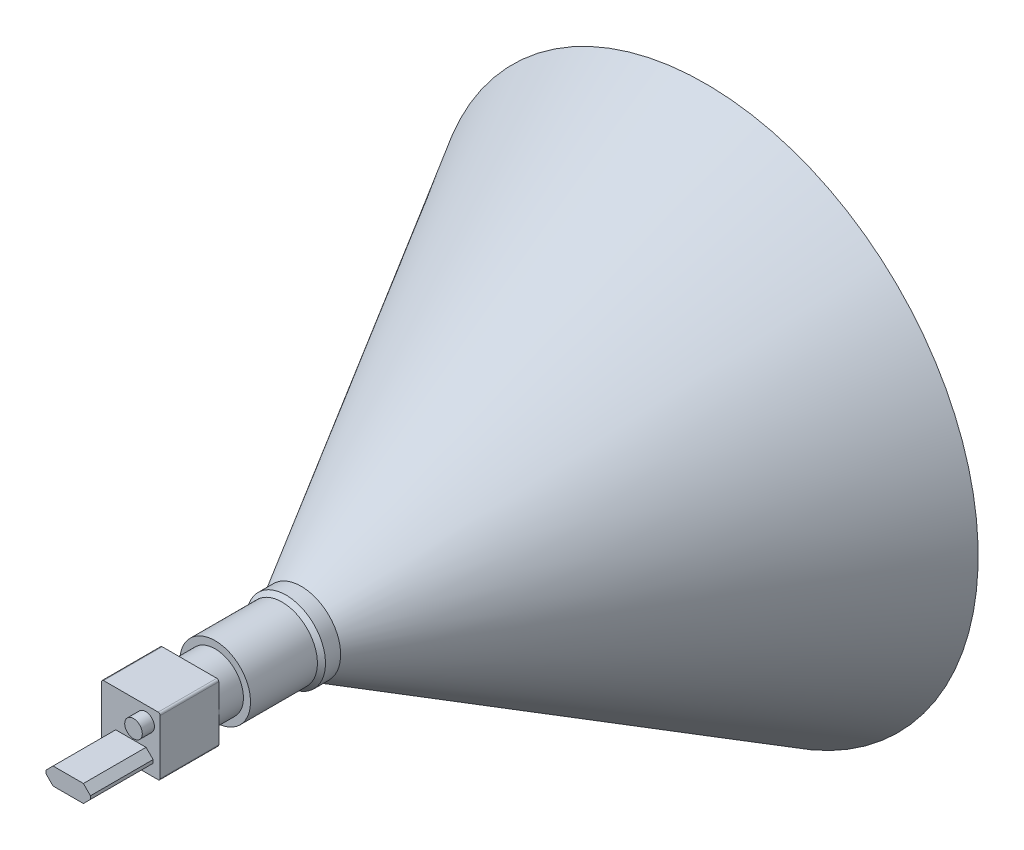
ISO-10303-21;
HEADER;
FILE_DESCRIPTION(('STEP AP214'),'2;1');
FILE_NAME('part.step','',(''),(''),'','','');
FILE_SCHEMA(('AUTOMOTIVE_DESIGN { 1 0 10303 214 1 1 1 1 }'));
ENDSEC;
DATA;
#1=APPLICATION_CONTEXT('core data for automotive mechanical design processes');
#2=APPLICATION_PROTOCOL_DEFINITION('international standard','automotive_design',2000,#1);
#3=PRODUCT_CONTEXT('',#1,'mechanical');
#4=PRODUCT('Part','Part','',(#3));
#5=PRODUCT_RELATED_PRODUCT_CATEGORY('part','',(#4));
#6=PRODUCT_DEFINITION_FORMATION('','',#4);
#7=PRODUCT_DEFINITION_CONTEXT('part definition',#1,'design');
#8=PRODUCT_DEFINITION('design','',#6,#7);
#9=PRODUCT_DEFINITION_SHAPE('','',#8);
#10=(LENGTH_UNIT() NAMED_UNIT(*) SI_UNIT(.MILLI.,.METRE.));
#11=(NAMED_UNIT(*) PLANE_ANGLE_UNIT() SI_UNIT($,.RADIAN.));
#12=(NAMED_UNIT(*) SI_UNIT($,.STERADIAN.) SOLID_ANGLE_UNIT());
#13=UNCERTAINTY_MEASURE_WITH_UNIT(LENGTH_MEASURE(1.E-05),#10,'distance_accuracy_value','');
#14=(GEOMETRIC_REPRESENTATION_CONTEXT(3) GLOBAL_UNCERTAINTY_ASSIGNED_CONTEXT((#13)) GLOBAL_UNIT_ASSIGNED_CONTEXT((#10,
#11,#12)) REPRESENTATION_CONTEXT('',''));
#15=CARTESIAN_POINT('',(0.,0.,0.));
#16=DIRECTION('',(0.,0.,1.));
#17=DIRECTION('',(1.,0.,0.));
#18=AXIS2_PLACEMENT_3D('',#15,#16,#17);
#19=CARTESIAN_POINT('',(0.,14.5,-69.8));
#20=DIRECTION('',(0.,0.,-1.));
#21=DIRECTION('',(-1.,0.,0.));
#22=AXIS2_PLACEMENT_3D('',#19,#20,#21);
#23=CONICAL_SURFACE('',#22,19.5,0.523598775598297);
#24=CARTESIAN_POINT('',(0.,14.5,-269.8));
#25=DIRECTION('',(0.,0.,-1.));
#26=DIRECTION('',(-1.,0.,0.));
#27=AXIS2_PLACEMENT_3D('',#24,#25,#26);
#28=CIRCLE('',#27,134.970053837925);
#29=CARTESIAN_POINT('',(-134.970053837925,14.5,-269.8));
#30=VERTEX_POINT('',#29);
#31=EDGE_CURVE('E11',#30,#30,#28,.T.);
#32=CARTESIAN_POINT('',(0.,14.5,-69.8));
#33=DIRECTION('',(0.,0.,-1.));
#34=DIRECTION('',(-1.,0.,0.));
#35=AXIS2_PLACEMENT_3D('',#32,#33,#34);
#36=CIRCLE('',#35,19.5);
#37=CARTESIAN_POINT('',(-19.5,14.5,-69.8));
#38=VERTEX_POINT('',#37);
#39=EDGE_CURVE('E47',#38,#38,#36,.T.);
#40=CARTESIAN_POINT('',(-134.970053837925,14.5,-269.8));
#41=CARTESIAN_POINT('',(-133.767240777113,14.5,-267.716666666667));
#42=CARTESIAN_POINT('',(-132.564427716301,14.5,-265.633333333333));
#43=CARTESIAN_POINT('',(-130.158801594678,14.5,-261.466666666667));
#44=CARTESIAN_POINT('',(-128.955988533866,14.5,-259.383333333333));
#45=CARTESIAN_POINT('',(-126.550362412243,14.5,-255.216666666667));
#46=CARTESIAN_POINT('',(-125.347549351431,14.5,-253.133333333333));
#47=CARTESIAN_POINT('',(-122.941923229807,14.5,-248.966666666667));
#48=CARTESIAN_POINT('',(-121.739110168996,14.5,-246.883333333333));
#49=CARTESIAN_POINT('',(-119.333484047372,14.5,-242.716666666667));
#50=CARTESIAN_POINT('',(-118.130670986561,14.5,-240.633333333333));
#51=CARTESIAN_POINT('',(-115.725044864937,14.5,-236.466666666667));
#52=CARTESIAN_POINT('',(-114.522231804125,14.5,-234.383333333333));
#53=CARTESIAN_POINT('',(-112.116605682502,14.5,-230.216666666667));
#54=CARTESIAN_POINT('',(-110.91379262169,14.5,-228.133333333333));
#55=CARTESIAN_POINT('',(-108.508166500067,14.5,-223.966666666667));
#56=CARTESIAN_POINT('',(-107.305353439255,14.5,-221.883333333333));
#57=CARTESIAN_POINT('',(-104.899727317632,14.5,-217.716666666667));
#58=CARTESIAN_POINT('',(-103.69691425682,14.5,-215.633333333333));
#59=CARTESIAN_POINT('',(-101.291288135197,14.5,-211.466666666667));
#60=CARTESIAN_POINT('',(-100.088475074385,14.5,-209.383333333333));
#61=CARTESIAN_POINT('',(-97.6828489527614,14.5,-205.216666666667));
#62=CARTESIAN_POINT('',(-96.4800358919497,14.5,-203.133333333333));
#63=CARTESIAN_POINT('',(-94.0744097703263,14.5,-198.966666666667));
#64=CARTESIAN_POINT('',(-92.8715967095145,14.5,-196.883333333333));
#65=CARTESIAN_POINT('',(-90.4659705878911,14.5,-192.716666666667));
#66=CARTESIAN_POINT('',(-89.2631575270794,14.5,-190.633333333333));
#67=CARTESIAN_POINT('',(-86.857531405456,14.5,-186.466666666667));
#68=CARTESIAN_POINT('',(-85.6547183446443,14.5,-184.383333333333));
#69=CARTESIAN_POINT('',(-83.2490922230208,14.5,-180.216666666667));
#70=CARTESIAN_POINT('',(-82.0462791622091,14.5,-178.133333333333));
#71=CARTESIAN_POINT('',(-79.6406530405857,14.5,-173.966666666667));
#72=CARTESIAN_POINT('',(-78.437839979774,14.5,-171.883333333333));
#73=CARTESIAN_POINT('',(-76.0322138581506,14.5,-167.716666666667));
#74=CARTESIAN_POINT('',(-74.8294007973388,14.5,-165.633333333333));
#75=CARTESIAN_POINT('',(-72.4237746757154,14.5,-161.466666666667));
#76=CARTESIAN_POINT('',(-71.2209616149037,14.5,-159.383333333333));
#77=CARTESIAN_POINT('',(-68.8153354932803,14.5,-155.216666666667));
#78=CARTESIAN_POINT('',(-67.6125224324686,14.5,-153.133333333333));
#79=CARTESIAN_POINT('',(-65.2068963108451,14.5,-148.966666666667));
#80=CARTESIAN_POINT('',(-64.0040832500334,14.5,-146.883333333333));
#81=CARTESIAN_POINT('',(-61.59845712841,14.5,-142.716666666667));
#82=CARTESIAN_POINT('',(-60.3956440675983,14.5,-140.633333333333));
#83=CARTESIAN_POINT('',(-57.9900179459748,14.5,-136.466666666667));
#84=CARTESIAN_POINT('',(-56.7872048851631,14.5,-134.383333333333));
#85=CARTESIAN_POINT('',(-54.3815787635397,14.5,-130.216666666667));
#86=CARTESIAN_POINT('',(-53.178765702728,14.5,-128.133333333333));
#87=CARTESIAN_POINT('',(-50.7731395811046,14.5,-123.966666666667));
#88=CARTESIAN_POINT('',(-49.5703265202928,14.5,-121.883333333333));
#89=CARTESIAN_POINT('',(-47.1647003986694,14.5,-117.716666666667));
#90=CARTESIAN_POINT('',(-45.9618873378577,14.5,-115.633333333333));
#91=CARTESIAN_POINT('',(-43.5562612162343,14.5,-111.466666666667));
#92=CARTESIAN_POINT('',(-42.3534481554226,14.5,-109.383333333333));
#93=CARTESIAN_POINT('',(-39.9478220337991,14.5,-105.216666666667));
#94=CARTESIAN_POINT('',(-38.7450089729874,14.5,-103.133333333333));
#95=CARTESIAN_POINT('',(-36.339382851364,14.5,-98.9666666666667));
#96=CARTESIAN_POINT('',(-35.1365697905523,14.5,-96.8833333333333));
#97=CARTESIAN_POINT('',(-32.7309436689289,14.5,-92.7166666666667));
#98=CARTESIAN_POINT('',(-31.5281306081171,14.5,-90.6333333333333));
#99=CARTESIAN_POINT('',(-29.1225044864937,14.5,-86.4666666666667));
#100=CARTESIAN_POINT('',(-27.919691425682,14.5,-84.3833333333333));
#101=CARTESIAN_POINT('',(-25.5140653040586,14.5,-80.2166666666667));
#102=CARTESIAN_POINT('',(-24.3112522432469,14.5,-78.1333333333333));
#103=CARTESIAN_POINT('',(-21.9056261216234,14.5,-73.9666666666667));
#104=CARTESIAN_POINT('',(-20.7028130608117,14.5,-71.8833333333333));
#105=CARTESIAN_POINT('',(-19.5,14.5,-69.8));
#106=B_SPLINE_CURVE_WITH_KNOTS('',3,(#40,#41,#42,#43,#44,#45,#46,#47,#48,#49,#50,#51,#52,#53,
#54,#55,#56,#57,#58,#59,#60,#61,#62,#63,#64,#65,#66,#67,#68,#69,#70,#71,#72,#73,#74,#75,#76,#77,
#78,#79,#80,#81,#82,#83,#84,#85,#86,#87,#88,#89,#90,#91,#92,#93,#94,#95,#96,#97,#98,#99,#100,
#101,#102,#103,#104,#105),.UNSPECIFIED.,.F.,.F.,(4,2,2,2,2,2,2,2,2,2,2,2,2,2,2,2,2,2,2,2,2,2,2,
2,2,2,2,2,2,2,2,2,4),(0.,7.21687836487034,14.4337567297407,21.650635094611,28.8675134594813,
36.0843918243516,43.3012701892219,50.5181485540922,57.7350269189625,64.9519052838328,
72.1687836487031,79.3856620135735,86.6025403784438,93.8194187433141,101.036297108184,
108.253175473055,115.470053837925,122.686932202795,129.903810567666,137.120688932536,
144.337567297406,151.554445662277,158.771324027147,165.988202392017,173.205080756887,
180.421959121758,187.638837486628,194.855715851498,202.072594216369,209.289472581239,
216.506350946109,223.72322931098,230.94010767585),.UNSPECIFIED.);
#107=EDGE_CURVE('BSEAM46',#30,#38,#106,.T.);
#108=ORIENTED_EDGE('',*,*,#31,.T.);
#109=ORIENTED_EDGE('',*,*,#39,.F.);
#110=ORIENTED_EDGE('',*,*,#107,.T.);
#111=ORIENTED_EDGE('',*,*,#107,.F.);
#112=EDGE_LOOP('',(#108,#110,#109,#111));
#113=FACE_BOUND('',#112,.T.);
#114=ADVANCED_FACE('F46',(#113),#23,.F.);
#115=OPEN_SHELL('',(#114));
#116=SHELL_BASED_SURFACE_MODEL('B2',(#115));
#117=CARTESIAN_POINT('',(-14.5,29.,14.5));
#118=DIRECTION('',(0.,0.,-1.));
#119=DIRECTION('',(-1.,0.,0.));
#120=AXIS2_PLACEMENT_3D('',#117,#118,#119);
#121=PLANE('',#120);
#122=CARTESIAN_POINT('',(7.3,21.8,14.5));
#123=DIRECTION('',(0.,0.,-1.));
#124=DIRECTION('',(-1.,0.,0.));
#125=AXIS2_PLACEMENT_3D('',#122,#123,#124);
#126=CIRCLE('',#125,4.35);
#127=CARTESIAN_POINT('',(2.95,21.8,14.5));
#128=VERTEX_POINT('',#127);
#129=EDGE_CURVE('E242',#128,#128,#126,.F.);
#130=ORIENTED_EDGE('',*,*,#129,.F.);
#131=EDGE_LOOP('',(#130));
#132=FACE_BOUND('',#131,.T.);
#133=DIRECTION('',(1.,0.,0.));
#134=VECTOR('',#133,1.);
#135=CARTESIAN_POINT('',(-14.5,0.,14.5));
#136=LINE('',#135,#134);
#137=CARTESIAN_POINT('',(-13.5,0.,14.5));
#138=VERTEX_POINT('',#137);
#139=CARTESIAN_POINT('',(13.5,0.,14.5));
#140=VERTEX_POINT('',#139);
#141=EDGE_CURVE('E347',#138,#140,#136,.T.);
#142=ORIENTED_EDGE('',*,*,#141,.T.);
#143=CARTESIAN_POINT('',(13.5,1.,14.5));
#144=DIRECTION('',(0.,0.,-1.));
#145=DIRECTION('',(-1.,0.,0.));
#146=AXIS2_PLACEMENT_3D('',#143,#144,#145);
#147=CIRCLE('',#146,1.);
#148=CARTESIAN_POINT('',(14.5,1.00000000000001,14.5));
#149=VERTEX_POINT('',#148);
#150=EDGE_CURVE('E230',#140,#149,#147,.F.);
#151=ORIENTED_EDGE('',*,*,#150,.T.);
#152=DIRECTION('',(0.,-1.,0.));
#153=VECTOR('',#152,1.);
#154=CARTESIAN_POINT('',(14.5,29.,14.5));
#155=LINE('',#154,#153);
#156=CARTESIAN_POINT('',(14.5,28.,14.5));
#157=VERTEX_POINT('',#156);
#158=EDGE_CURVE('E350',#157,#149,#155,.T.);
#159=ORIENTED_EDGE('',*,*,#158,.F.);
#160=CARTESIAN_POINT('',(13.5,28.,14.5));
#161=DIRECTION('',(0.,0.,-1.));
#162=DIRECTION('',(-1.,0.,0.));
#163=AXIS2_PLACEMENT_3D('',#160,#161,#162);
#164=CIRCLE('',#163,1.);
#165=CARTESIAN_POINT('',(13.5,29.,14.5));
#166=VERTEX_POINT('',#165);
#167=EDGE_CURVE('E207',#157,#166,#164,.F.);
#168=ORIENTED_EDGE('',*,*,#167,.T.);
#169=DIRECTION('',(1.,0.,0.));
#170=VECTOR('',#169,1.);
#171=CARTESIAN_POINT('',(-14.5,29.,14.5));
#172=LINE('',#171,#170);
#173=CARTESIAN_POINT('',(-13.5,29.,14.5));
#174=VERTEX_POINT('',#173);
#175=EDGE_CURVE('E346',#174,#166,#172,.T.);
#176=ORIENTED_EDGE('',*,*,#175,.F.);
#177=CARTESIAN_POINT('',(-13.5,28.,14.5));
#178=DIRECTION('',(0.,0.,-1.));
#179=DIRECTION('',(-1.,0.,0.));
#180=AXIS2_PLACEMENT_3D('',#177,#178,#179);
#181=CIRCLE('',#180,1.);
#182=CARTESIAN_POINT('',(-14.5,28.,14.5));
#183=VERTEX_POINT('',#182);
#184=EDGE_CURVE('E226',#174,#183,#181,.F.);
#185=ORIENTED_EDGE('',*,*,#184,.T.);
#186=DIRECTION('',(0.,-1.,0.));
#187=VECTOR('',#186,1.);
#188=CARTESIAN_POINT('',(-14.5,29.,14.5));
#189=LINE('',#188,#187);
#190=CARTESIAN_POINT('',(-14.5,1.00000000000001,14.5));
#191=VERTEX_POINT('',#190);
#192=EDGE_CURVE('E356',#183,#191,#189,.T.);
#193=ORIENTED_EDGE('',*,*,#192,.T.);
#194=CARTESIAN_POINT('',(-13.5,1.,14.5));
#195=DIRECTION('',(0.,0.,-1.));
#196=DIRECTION('',(-1.,0.,0.));
#197=AXIS2_PLACEMENT_3D('',#194,#195,#196);
#198=CIRCLE('',#197,1.);
#199=EDGE_CURVE('E228',#191,#138,#198,.F.);
#200=ORIENTED_EDGE('',*,*,#199,.T.);
#201=EDGE_LOOP('',(#142,#151,#159,#168,#176,#185,#193,#200));
#202=FACE_BOUND('',#201,.T.);
#203=DIRECTION('',(0.,-1.,0.));
#204=VECTOR('',#203,1.);
#205=CARTESIAN_POINT('',(-11.,10.9,14.5));
#206=LINE('',#205,#204);
#207=CARTESIAN_POINT('',(-11.,7.4,14.5));
#208=VERTEX_POINT('',#207);
#209=CARTESIAN_POINT('',(-11.,5.80000000000001,14.5));
#210=VERTEX_POINT('',#209);
#211=EDGE_CURVE('E312',#208,#210,#206,.T.);
#212=ORIENTED_EDGE('',*,*,#211,.F.);
#213=DIRECTION('',(-0.707106781186549,-0.707106781186546,0.));
#214=VECTOR('',#213,1.);
#215=CARTESIAN_POINT('',(-1.95000000000001,16.45,14.5));
#216=LINE('',#215,#214);
#217=CARTESIAN_POINT('',(-7.49999999999998,10.9,14.5));
#218=VERTEX_POINT('',#217);
#219=EDGE_CURVE('E44',#208,#218,#216,.F.);
#220=ORIENTED_EDGE('',*,*,#219,.T.);
#221=DIRECTION('',(-1.,0.,0.));
#222=VECTOR('',#221,1.);
#223=CARTESIAN_POINT('',(-11.,10.9,14.5));
#224=LINE('',#223,#222);
#225=CARTESIAN_POINT('',(7.49999999999998,10.9,14.5));
#226=VERTEX_POINT('',#225);
#227=EDGE_CURVE('E280',#226,#218,#224,.T.);
#228=ORIENTED_EDGE('',*,*,#227,.F.);
#229=DIRECTION('',(-0.707106781186546,0.707106781186549,0.));
#230=VECTOR('',#229,1.);
#231=CARTESIAN_POINT('',(-12.55,30.95,14.5));
#232=LINE('',#231,#230);
#233=CARTESIAN_POINT('',(11.,7.39999999999997,14.5));
#234=VERTEX_POINT('',#233);
#235=EDGE_CURVE('E274',#226,#234,#232,.F.);
#236=ORIENTED_EDGE('',*,*,#235,.T.);
#237=DIRECTION('',(0.,1.,0.));
#238=VECTOR('',#237,1.);
#239=CARTESIAN_POINT('',(11.,10.9,14.5));
#240=LINE('',#239,#238);
#241=CARTESIAN_POINT('',(11.,5.8,14.5));
#242=VERTEX_POINT('',#241);
#243=EDGE_CURVE('E278',#242,#234,#240,.T.);
#244=ORIENTED_EDGE('',*,*,#243,.F.);
#245=DIRECTION('',(0.707106781186549,0.707106781186546,0.));
#246=VECTOR('',#245,1.);
#247=CARTESIAN_POINT('',(9.84999999999996,4.64999999999996,14.5));
#248=LINE('',#247,#246);
#249=CARTESIAN_POINT('',(7.49999999999998,2.3,14.5));
#250=VERTEX_POINT('',#249);
#251=EDGE_CURVE('E272',#242,#250,#248,.F.);
#252=ORIENTED_EDGE('',*,*,#251,.T.);
#253=DIRECTION('',(1.,0.,0.));
#254=VECTOR('',#253,1.);
#255=CARTESIAN_POINT('',(-11.,2.3,14.5));
#256=LINE('',#255,#254);
#257=CARTESIAN_POINT('',(-7.5,2.3,14.5));
#258=VERTEX_POINT('',#257);
#259=EDGE_CURVE('E289',#258,#250,#256,.T.);
#260=ORIENTED_EDGE('',*,*,#259,.F.);
#261=DIRECTION('',(0.707106781186548,-0.707106781186548,0.));
#262=VECTOR('',#261,1.);
#263=CARTESIAN_POINT('',(-24.35,19.15,14.5));
#264=LINE('',#263,#262);
#265=EDGE_CURVE('E78',#258,#210,#264,.F.);
#266=ORIENTED_EDGE('',*,*,#265,.T.);
#267=EDGE_LOOP('',(#212,#220,#228,#236,#244,#252,#260,#266));
#268=FACE_BOUND('',#267,.T.);
#269=ADVANCED_FACE('F70',(#132,#202,#268),#121,.F.);
#270=CARTESIAN_POINT('',(14.5,29.,-14.5));
#271=DIRECTION('',(-1.,0.,0.));
#272=DIRECTION('',(0.,0.,1.));
#273=AXIS2_PLACEMENT_3D('',#270,#271,#272);
#274=PLANE('',#273);
#275=ORIENTED_EDGE('',*,*,#158,.T.);
#276=DIRECTION('',(0.,0.,-1.));
#277=VECTOR('',#276,1.);
#278=CARTESIAN_POINT('',(14.5,1.,-14.5));
#279=LINE('',#278,#277);
#280=CARTESIAN_POINT('',(14.5,1.00000000000001,-14.5));
#281=VERTEX_POINT('',#280);
#282=EDGE_CURVE('E193',#149,#281,#279,.T.);
#283=ORIENTED_EDGE('',*,*,#282,.T.);
#284=DIRECTION('',(0.,-1.,0.));
#285=VECTOR('',#284,1.);
#286=CARTESIAN_POINT('',(14.5,29.,-14.5));
#287=LINE('',#286,#285);
#288=CARTESIAN_POINT('',(14.5,28.,-14.5));
#289=VERTEX_POINT('',#288);
#290=EDGE_CURVE('E185',#289,#281,#287,.T.);
#291=ORIENTED_EDGE('',*,*,#290,.F.);
#292=DIRECTION('',(0.,0.,-1.));
#293=VECTOR('',#292,1.);
#294=CARTESIAN_POINT('',(14.5,28.,14.5));
#295=LINE('',#294,#293);
#296=EDGE_CURVE('E199',#289,#157,#295,.F.);
#297=ORIENTED_EDGE('',*,*,#296,.T.);
#298=EDGE_LOOP('',(#275,#283,#291,#297));
#299=FACE_BOUND('',#298,.T.);
#300=ADVANCED_FACE('F198',(#299),#274,.F.);
#301=CARTESIAN_POINT('',(-14.5,29.,-14.5));
#302=DIRECTION('',(0.,0.,1.));
#303=DIRECTION('',(1.,0.,0.));
#304=AXIS2_PLACEMENT_3D('',#301,#302,#303);
#305=PLANE('',#304);
#306=CARTESIAN_POINT('',(0.,14.5,-14.5));
#307=DIRECTION('',(0.,0.,-1.));
#308=DIRECTION('',(-1.,0.,0.));
#309=AXIS2_PLACEMENT_3D('',#306,#307,#308);
#310=CIRCLE('',#309,14.);
#311=CARTESIAN_POINT('',(-14.,14.5,-14.5));
#312=VERTEX_POINT('',#311);
#313=EDGE_CURVE('E202',#312,#312,#310,.T.);
#314=ORIENTED_EDGE('',*,*,#313,.F.);
#315=EDGE_LOOP('',(#314));
#316=FACE_BOUND('',#315,.T.);
#317=ORIENTED_EDGE('',*,*,#290,.T.);
#318=CARTESIAN_POINT('',(13.5,1.,-14.5));
#319=DIRECTION('',(0.,0.,1.));
#320=DIRECTION('',(1.,0.,0.));
#321=AXIS2_PLACEMENT_3D('',#318,#319,#320);
#322=CIRCLE('',#321,1.);
#323=CARTESIAN_POINT('',(13.5,0.,-14.5));
#324=VERTEX_POINT('',#323);
#325=EDGE_CURVE('E219',#281,#324,#322,.F.);
#326=ORIENTED_EDGE('',*,*,#325,.T.);
#327=DIRECTION('',(-1.,0.,0.));
#328=VECTOR('',#327,1.);
#329=CARTESIAN_POINT('',(-14.5,0.,-14.5));
#330=LINE('',#329,#328);
#331=CARTESIAN_POINT('',(-13.5,0.,-14.5));
#332=VERTEX_POINT('',#331);
#333=EDGE_CURVE('E330',#324,#332,#330,.T.);
#334=ORIENTED_EDGE('',*,*,#333,.T.);
#335=CARTESIAN_POINT('',(-13.5,1.,-14.5));
#336=DIRECTION('',(0.,0.,1.));
#337=DIRECTION('',(1.,0.,0.));
#338=AXIS2_PLACEMENT_3D('',#335,#336,#337);
#339=CIRCLE('',#338,1.);
#340=CARTESIAN_POINT('',(-14.5,1.00000000000001,-14.5));
#341=VERTEX_POINT('',#340);
#342=EDGE_CURVE('E217',#332,#341,#339,.F.);
#343=ORIENTED_EDGE('',*,*,#342,.T.);
#344=DIRECTION('',(0.,-1.,0.));
#345=VECTOR('',#344,1.);
#346=CARTESIAN_POINT('',(-14.5,29.,-14.5));
#347=LINE('',#346,#345);
#348=CARTESIAN_POINT('',(-14.5,28.,-14.5));
#349=VERTEX_POINT('',#348);
#350=EDGE_CURVE('E203',#349,#341,#347,.T.);
#351=ORIENTED_EDGE('',*,*,#350,.F.);
#352=CARTESIAN_POINT('',(-13.5,28.,-14.5));
#353=DIRECTION('',(0.,0.,1.));
#354=DIRECTION('',(1.,0.,0.));
#355=AXIS2_PLACEMENT_3D('',#352,#353,#354);
#356=CIRCLE('',#355,1.);
#357=CARTESIAN_POINT('',(-13.5,29.,-14.5));
#358=VERTEX_POINT('',#357);
#359=EDGE_CURVE('E192',#349,#358,#356,.F.);
#360=ORIENTED_EDGE('',*,*,#359,.T.);
#361=DIRECTION('',(-1.,0.,0.));
#362=VECTOR('',#361,1.);
#363=CARTESIAN_POINT('',(-14.5,29.,-14.5));
#364=LINE('',#363,#362);
#365=CARTESIAN_POINT('',(13.5,29.,-14.5));
#366=VERTEX_POINT('',#365);
#367=EDGE_CURVE('E187',#366,#358,#364,.T.);
#368=ORIENTED_EDGE('',*,*,#367,.F.);
#369=CARTESIAN_POINT('',(13.5,28.,-14.5));
#370=DIRECTION('',(0.,0.,1.));
#371=DIRECTION('',(1.,0.,0.));
#372=AXIS2_PLACEMENT_3D('',#369,#370,#371);
#373=CIRCLE('',#372,1.);
#374=EDGE_CURVE('E182',#366,#289,#373,.F.);
#375=ORIENTED_EDGE('',*,*,#374,.T.);
#376=EDGE_LOOP('',(#317,#326,#334,#343,#351,#360,#368,#375));
#377=FACE_BOUND('',#376,.T.);
#378=ADVANCED_FACE('F184',(#316,#377),#305,.F.);
#379=CARTESIAN_POINT('',(-14.5,29.,-14.5));
#380=DIRECTION('',(1.,0.,0.));
#381=DIRECTION('',(0.,0.,-1.));
#382=AXIS2_PLACEMENT_3D('',#379,#380,#381);
#383=PLANE('',#382);
#384=ORIENTED_EDGE('',*,*,#350,.T.);
#385=DIRECTION('',(0.,0.,1.));
#386=VECTOR('',#385,1.);
#387=CARTESIAN_POINT('',(-14.5,1.,-14.5));
#388=LINE('',#387,#386);
#389=EDGE_CURVE('E234',#341,#191,#388,.T.);
#390=ORIENTED_EDGE('',*,*,#389,.T.);
#391=ORIENTED_EDGE('',*,*,#192,.F.);
#392=DIRECTION('',(0.,0.,1.));
#393=VECTOR('',#392,1.);
#394=CARTESIAN_POINT('',(-14.5,28.,-14.5));
#395=LINE('',#394,#393);
#396=EDGE_CURVE('E232',#183,#349,#395,.F.);
#397=ORIENTED_EDGE('',*,*,#396,.T.);
#398=EDGE_LOOP('',(#384,#390,#391,#397));
#399=FACE_BOUND('',#398,.T.);
#400=ADVANCED_FACE('F395',(#399),#383,.F.);
#401=CARTESIAN_POINT('',(0.,29.,0.));
#402=DIRECTION('',(0.,1.,0.));
#403=DIRECTION('',(0.,0.,1.));
#404=AXIS2_PLACEMENT_3D('',#401,#402,#403);
#405=PLANE('',#404);
#406=ORIENTED_EDGE('',*,*,#367,.T.);
#407=DIRECTION('',(0.,0.,1.));
#408=VECTOR('',#407,1.);
#409=CARTESIAN_POINT('',(-13.5,29.,14.5));
#410=LINE('',#409,#408);
#411=EDGE_CURVE('E239',#358,#174,#410,.T.);
#412=ORIENTED_EDGE('',*,*,#411,.T.);
#413=ORIENTED_EDGE('',*,*,#175,.T.);
#414=DIRECTION('',(0.,0.,-1.));
#415=VECTOR('',#414,1.);
#416=CARTESIAN_POINT('',(13.5,29.,-14.5));
#417=LINE('',#416,#415);
#418=EDGE_CURVE('E237',#166,#366,#417,.T.);
#419=ORIENTED_EDGE('',*,*,#418,.T.);
#420=EDGE_LOOP('',(#406,#412,#413,#419));
#421=FACE_BOUND('',#420,.T.);
#422=ADVANCED_FACE('F398',(#421),#405,.T.);
#423=CARTESIAN_POINT('',(0.,0.,0.));
#424=DIRECTION('',(0.,1.,0.));
#425=DIRECTION('',(0.,0.,1.));
#426=AXIS2_PLACEMENT_3D('',#423,#424,#425);
#427=PLANE('',#426);
#428=CARTESIAN_POINT('',(-10.,0.,-11.5));
#429=DIRECTION('',(0.,-1.,0.));
#430=DIRECTION('',(0.,0.,-1.));
#431=AXIS2_PLACEMENT_3D('',#428,#429,#430);
#432=CIRCLE('',#431,1.7);
#433=CARTESIAN_POINT('',(-10.,0.,-13.2));
#434=VERTEX_POINT('',#433);
#435=EDGE_CURVE('E331',#434,#434,#432,.T.);
#436=ORIENTED_EDGE('',*,*,#435,.F.);
#437=EDGE_LOOP('',(#436));
#438=FACE_BOUND('',#437,.T.);
#439=CARTESIAN_POINT('',(9.99999999999999,0.,-11.5));
#440=DIRECTION('',(0.,-1.,0.));
#441=DIRECTION('',(0.,0.,-1.));
#442=AXIS2_PLACEMENT_3D('',#439,#440,#441);
#443=CIRCLE('',#442,1.7);
#444=CARTESIAN_POINT('',(9.99999999999999,0.,-13.2));
#445=VERTEX_POINT('',#444);
#446=EDGE_CURVE('E337',#445,#445,#443,.T.);
#447=ORIENTED_EDGE('',*,*,#446,.F.);
#448=EDGE_LOOP('',(#447));
#449=FACE_BOUND('',#448,.T.);
#450=CARTESIAN_POINT('',(0.,0.,12.));
#451=DIRECTION('',(0.,-1.,0.));
#452=DIRECTION('',(0.,0.,-1.));
#453=AXIS2_PLACEMENT_3D('',#450,#451,#452);
#454=CIRCLE('',#453,1.7);
#455=CARTESIAN_POINT('',(0.,0.,10.3));
#456=VERTEX_POINT('',#455);
#457=EDGE_CURVE('E324',#456,#456,#454,.T.);
#458=ORIENTED_EDGE('',*,*,#457,.F.);
#459=EDGE_LOOP('',(#458));
#460=FACE_BOUND('',#459,.T.);
#461=ORIENTED_EDGE('',*,*,#333,.F.);
#462=DIRECTION('',(0.,0.,-1.));
#463=VECTOR('',#462,1.);
#464=CARTESIAN_POINT('',(13.5,0.,0.));
#465=LINE('',#464,#463);
#466=EDGE_CURVE('E223',#324,#140,#465,.F.);
#467=ORIENTED_EDGE('',*,*,#466,.T.);
#468=ORIENTED_EDGE('',*,*,#141,.F.);
#469=DIRECTION('',(0.,0.,1.));
#470=VECTOR('',#469,1.);
#471=CARTESIAN_POINT('',(-13.5,0.,0.));
#472=LINE('',#471,#470);
#473=EDGE_CURVE('E221',#138,#332,#472,.F.);
#474=ORIENTED_EDGE('',*,*,#473,.T.);
#475=EDGE_LOOP('',(#461,#467,#468,#474));
#476=FACE_BOUND('',#475,.T.);
#477=ADVANCED_FACE('F393',(#438,#449,#460,#476),#427,.F.);
#478=CARTESIAN_POINT('',(0.,4.,12.));
#479=DIRECTION('',(0.,-1.,0.));
#480=DIRECTION('',(0.,0.,-1.));
#481=AXIS2_PLACEMENT_3D('',#478,#479,#480);
#482=CYLINDRICAL_SURFACE('',#481,1.7);
#483=CARTESIAN_POINT('',(0.,4.,12.));
#484=DIRECTION('',(0.,-1.,0.));
#485=DIRECTION('',(0.,0.,-1.));
#486=AXIS2_PLACEMENT_3D('',#483,#484,#485);
#487=CIRCLE('',#486,1.7);
#488=CARTESIAN_POINT('',(0.,4.,10.3));
#489=VERTEX_POINT('',#488);
#490=EDGE_CURVE('E340',#489,#489,#487,.T.);
#491=ORIENTED_EDGE('',*,*,#490,.F.);
#492=EDGE_LOOP('',(#491));
#493=FACE_BOUND('',#492,.T.);
#494=ORIENTED_EDGE('',*,*,#457,.T.);
#495=EDGE_LOOP('',(#494));
#496=FACE_BOUND('',#495,.T.);
#497=ADVANCED_FACE('F439',(#493,#496),#482,.F.);
#498=CARTESIAN_POINT('',(0.,4.,12.));
#499=DIRECTION('',(0.,-1.,0.));
#500=DIRECTION('',(0.,0.,-1.));
#501=AXIS2_PLACEMENT_3D('',#498,#499,#500);
#502=PLANE('',#501);
#503=ORIENTED_EDGE('',*,*,#490,.T.);
#504=EDGE_LOOP('',(#503));
#505=FACE_BOUND('',#504,.T.);
#506=ADVANCED_FACE('F435',(#505),#502,.T.);
#507=CARTESIAN_POINT('',(9.99999999999999,4.,-11.5));
#508=DIRECTION('',(0.,-1.,0.));
#509=DIRECTION('',(0.,0.,-1.));
#510=AXIS2_PLACEMENT_3D('',#507,#508,#509);
#511=CYLINDRICAL_SURFACE('',#510,1.7);
#512=CARTESIAN_POINT('',(9.99999999999999,4.,-11.5));
#513=DIRECTION('',(0.,-1.,0.));
#514=DIRECTION('',(0.,0.,-1.));
#515=AXIS2_PLACEMENT_3D('',#512,#513,#514);
#516=CIRCLE('',#515,1.7);
#517=CARTESIAN_POINT('',(9.99999999999999,4.,-13.2));
#518=VERTEX_POINT('',#517);
#519=EDGE_CURVE('E334',#518,#518,#516,.T.);
#520=ORIENTED_EDGE('',*,*,#519,.F.);
#521=EDGE_LOOP('',(#520));
#522=FACE_BOUND('',#521,.T.);
#523=ORIENTED_EDGE('',*,*,#446,.T.);
#524=EDGE_LOOP('',(#523));
#525=FACE_BOUND('',#524,.T.);
#526=ADVANCED_FACE('F431',(#522,#525),#511,.F.);
#527=CARTESIAN_POINT('',(9.99999999999999,4.,-11.5));
#528=DIRECTION('',(0.,-1.,0.));
#529=DIRECTION('',(0.,0.,-1.));
#530=AXIS2_PLACEMENT_3D('',#527,#528,#529);
#531=PLANE('',#530);
#532=ORIENTED_EDGE('',*,*,#519,.T.);
#533=EDGE_LOOP('',(#532));
#534=FACE_BOUND('',#533,.T.);
#535=ADVANCED_FACE('F427',(#534),#531,.T.);
#536=CARTESIAN_POINT('',(-10.,4.,-11.5));
#537=DIRECTION('',(0.,-1.,0.));
#538=DIRECTION('',(0.,0.,-1.));
#539=AXIS2_PLACEMENT_3D('',#536,#537,#538);
#540=CYLINDRICAL_SURFACE('',#539,1.7);
#541=CARTESIAN_POINT('',(-10.,4.,-11.5));
#542=DIRECTION('',(0.,-1.,0.));
#543=DIRECTION('',(0.,0.,-1.));
#544=AXIS2_PLACEMENT_3D('',#541,#542,#543);
#545=CIRCLE('',#544,1.7);
#546=CARTESIAN_POINT('',(-10.,4.,-13.2));
#547=VERTEX_POINT('',#546);
#548=EDGE_CURVE('E327',#547,#547,#545,.T.);
#549=ORIENTED_EDGE('',*,*,#548,.F.);
#550=EDGE_LOOP('',(#549));
#551=FACE_BOUND('',#550,.T.);
#552=ORIENTED_EDGE('',*,*,#435,.T.);
#553=EDGE_LOOP('',(#552));
#554=FACE_BOUND('',#553,.T.);
#555=ADVANCED_FACE('F419',(#551,#554),#540,.F.);
#556=CARTESIAN_POINT('',(-10.,4.,-11.5));
#557=DIRECTION('',(0.,-1.,0.));
#558=DIRECTION('',(0.,0.,-1.));
#559=AXIS2_PLACEMENT_3D('',#556,#557,#558);
#560=PLANE('',#559);
#561=ORIENTED_EDGE('',*,*,#548,.T.);
#562=EDGE_LOOP('',(#561));
#563=FACE_BOUND('',#562,.T.);
#564=ADVANCED_FACE('F409',(#563),#560,.T.);
#565=CARTESIAN_POINT('',(0.,14.5,-27.2));
#566=DIRECTION('',(0.,0.,1.));
#567=DIRECTION('',(1.,0.,0.));
#568=AXIS2_PLACEMENT_3D('',#565,#566,#567);
#569=CYLINDRICAL_SURFACE('',#568,14.);
#570=CARTESIAN_POINT('',(0.,14.5,-27.2));
#571=DIRECTION('',(0.,0.,-1.));
#572=DIRECTION('',(-1.,0.,0.));
#573=AXIS2_PLACEMENT_3D('',#570,#571,#572);
#574=CIRCLE('',#573,14.);
#575=CARTESIAN_POINT('',(-14.,14.5,-27.2));
#576=VERTEX_POINT('',#575);
#577=EDGE_CURVE('E321',#576,#576,#574,.T.);
#578=ORIENTED_EDGE('',*,*,#577,.F.);
#579=EDGE_LOOP('',(#578));
#580=FACE_BOUND('',#579,.T.);
#581=ORIENTED_EDGE('',*,*,#313,.T.);
#582=EDGE_LOOP('',(#581));
#583=FACE_BOUND('',#582,.T.);
#584=ADVANCED_FACE('F406',(#580,#583),#569,.T.);
#585=CARTESIAN_POINT('',(0.,14.5,-59.8));
#586=DIRECTION('',(0.,0.,1.));
#587=DIRECTION('',(1.,0.,0.));
#588=AXIS2_PLACEMENT_3D('',#585,#586,#587);
#589=CYLINDRICAL_SURFACE('',#588,17.5);
#590=CARTESIAN_POINT('',(0.,14.5,-60.3));
#591=DIRECTION('',(0.,0.,-1.));
#592=DIRECTION('',(-1.,0.,0.));
#593=AXIS2_PLACEMENT_3D('',#590,#591,#592);
#594=CIRCLE('',#593,17.5);
#595=CARTESIAN_POINT('',(-17.5,14.5,-60.3));
#596=VERTEX_POINT('',#595);
#597=EDGE_CURVE('E208',#596,#596,#594,.F.);
#598=ORIENTED_EDGE('',*,*,#597,.T.);
#599=EDGE_LOOP('',(#598));
#600=FACE_BOUND('',#599,.T.);
#601=CARTESIAN_POINT('',(0.,14.5,-27.2));
#602=DIRECTION('',(0.,0.,-1.));
#603=DIRECTION('',(-1.,0.,0.));
#604=AXIS2_PLACEMENT_3D('',#601,#602,#603);
#605=CIRCLE('',#604,17.5);
#606=CARTESIAN_POINT('',(-17.5,14.5,-27.2));
#607=VERTEX_POINT('',#606);
#608=EDGE_CURVE('E306',#607,#607,#605,.T.);
#609=ORIENTED_EDGE('',*,*,#608,.T.);
#610=EDGE_LOOP('',(#609));
#611=FACE_BOUND('',#610,.T.);
#612=ADVANCED_FACE('F408',(#600,#611),#589,.T.);
#613=CARTESIAN_POINT('',(0.,14.5,-27.2));
#614=DIRECTION('',(0.,0.,-1.));
#615=DIRECTION('',(-1.,0.,0.));
#616=AXIS2_PLACEMENT_3D('',#613,#614,#615);
#617=PLANE('',#616);
#618=ORIENTED_EDGE('',*,*,#577,.T.);
#619=EDGE_LOOP('',(#618));
#620=FACE_BOUND('',#619,.T.);
#621=ORIENTED_EDGE('',*,*,#608,.F.);
#622=EDGE_LOOP('',(#621));
#623=FACE_BOUND('',#622,.T.);
#624=ADVANCED_FACE('F416',(#620,#623),#617,.F.);
#625=CARTESIAN_POINT('',(0.,14.5,-69.8));
#626=DIRECTION('',(0.,0.,1.));
#627=DIRECTION('',(1.,0.,0.));
#628=AXIS2_PLACEMENT_3D('',#625,#626,#627);
#629=CYLINDRICAL_SURFACE('',#628,19.5);
#630=CARTESIAN_POINT('',(0.,14.5,-62.3));
#631=DIRECTION('',(0.,0.,-1.));
#632=DIRECTION('',(-1.,0.,0.));
#633=AXIS2_PLACEMENT_3D('',#630,#631,#632);
#634=CIRCLE('',#633,19.5);
#635=CARTESIAN_POINT('',(-19.5,14.5,-62.3));
#636=VERTEX_POINT('',#635);
#637=EDGE_CURVE('E212',#636,#636,#634,.T.);
#638=ORIENTED_EDGE('',*,*,#637,.T.);
#639=EDGE_LOOP('',(#638));
#640=FACE_BOUND('',#639,.T.);
#641=CARTESIAN_POINT('',(0.,14.5,-69.8));
#642=DIRECTION('',(0.,0.,-1.));
#643=DIRECTION('',(-1.,0.,0.));
#644=AXIS2_PLACEMENT_3D('',#641,#642,#643);
#645=CIRCLE('',#644,19.5);
#646=CARTESIAN_POINT('',(-19.5,14.5,-69.8));
#647=VERTEX_POINT('',#646);
#648=EDGE_CURVE('E303',#647,#647,#645,.T.);
#649=ORIENTED_EDGE('',*,*,#648,.F.);
#650=EDGE_LOOP('',(#649));
#651=FACE_BOUND('',#650,.T.);
#652=ADVANCED_FACE('F363',(#640,#651),#629,.T.);
#653=CARTESIAN_POINT('',(0.,14.5,-69.8));
#654=DIRECTION('',(0.,0.,-1.));
#655=DIRECTION('',(-1.,0.,0.));
#656=AXIS2_PLACEMENT_3D('',#653,#654,#655);
#657=PLANE('',#656);
#658=ORIENTED_EDGE('',*,*,#648,.T.);
#659=EDGE_LOOP('',(#658));
#660=FACE_BOUND('',#659,.T.);
#661=ADVANCED_FACE('F369',(#660),#657,.T.);
#662=CARTESIAN_POINT('',(0.,14.5,-62.3));
#663=DIRECTION('',(0.,0.,-1.));
#664=DIRECTION('',(-1.,0.,0.));
#665=AXIS2_PLACEMENT_3D('',#662,#663,#664);
#666=CONICAL_SURFACE('',#665,19.5,0.785398163397443);
#667=ORIENTED_EDGE('',*,*,#597,.F.);
#668=EDGE_LOOP('',(#667));
#669=FACE_BOUND('',#668,.T.);
#670=ORIENTED_EDGE('',*,*,#637,.F.);
#671=EDGE_LOOP('',(#670));
#672=FACE_BOUND('',#671,.T.);
#673=ADVANCED_FACE('F366',(#669,#672),#666,.T.);
#674=CARTESIAN_POINT('',(13.5,1.,-14.5));
#675=DIRECTION('',(0.,0.,-1.));
#676=DIRECTION('',(-1.,0.,0.));
#677=AXIS2_PLACEMENT_3D('',#674,#675,#676);
#678=CYLINDRICAL_SURFACE('',#677,1.);
#679=ORIENTED_EDGE('',*,*,#150,.F.);
#680=ORIENTED_EDGE('',*,*,#466,.F.);
#681=ORIENTED_EDGE('',*,*,#325,.F.);
#682=ORIENTED_EDGE('',*,*,#282,.F.);
#683=EDGE_LOOP('',(#679,#680,#681,#682));
#684=FACE_BOUND('',#683,.T.);
#685=ADVANCED_FACE('F368',(#684),#678,.T.);
#686=CARTESIAN_POINT('',(-13.5,1.,-14.5));
#687=DIRECTION('',(0.,0.,1.));
#688=DIRECTION('',(1.,0.,0.));
#689=AXIS2_PLACEMENT_3D('',#686,#687,#688);
#690=CYLINDRICAL_SURFACE('',#689,1.);
#691=ORIENTED_EDGE('',*,*,#342,.F.);
#692=ORIENTED_EDGE('',*,*,#473,.F.);
#693=ORIENTED_EDGE('',*,*,#199,.F.);
#694=ORIENTED_EDGE('',*,*,#389,.F.);
#695=EDGE_LOOP('',(#691,#692,#693,#694));
#696=FACE_BOUND('',#695,.T.);
#697=ADVANCED_FACE('F376',(#696),#690,.T.);
#698=CARTESIAN_POINT('',(-13.5,28.,0.));
#699=DIRECTION('',(0.,0.,-1.));
#700=DIRECTION('',(-1.,0.,0.));
#701=AXIS2_PLACEMENT_3D('',#698,#699,#700);
#702=CYLINDRICAL_SURFACE('',#701,1.);
#703=ORIENTED_EDGE('',*,*,#359,.F.);
#704=ORIENTED_EDGE('',*,*,#396,.F.);
#705=ORIENTED_EDGE('',*,*,#184,.F.);
#706=ORIENTED_EDGE('',*,*,#411,.F.);
#707=EDGE_LOOP('',(#703,#704,#705,#706));
#708=FACE_BOUND('',#707,.T.);
#709=ADVANCED_FACE('F453',(#708),#702,.T.);
#710=CARTESIAN_POINT('',(13.5,28.,0.));
#711=DIRECTION('',(0.,0.,1.));
#712=DIRECTION('',(1.,0.,0.));
#713=AXIS2_PLACEMENT_3D('',#710,#711,#712);
#714=CYLINDRICAL_SURFACE('',#713,1.);
#715=ORIENTED_EDGE('',*,*,#167,.F.);
#716=ORIENTED_EDGE('',*,*,#296,.F.);
#717=ORIENTED_EDGE('',*,*,#374,.F.);
#718=ORIENTED_EDGE('',*,*,#418,.F.);
#719=EDGE_LOOP('',(#715,#716,#717,#718));
#720=FACE_BOUND('',#719,.T.);
#721=ADVANCED_FACE('F206',(#720),#714,.T.);
#722=CARTESIAN_POINT('',(-11.,10.9,45.5));
#723=DIRECTION('',(1.,0.,0.));
#724=DIRECTION('',(0.,1.,0.));
#725=AXIS2_PLACEMENT_3D('',#722,#723,#724);
#726=PLANE('',#725);
#727=ORIENTED_EDGE('',*,*,#211,.T.);
#728=DIRECTION('',(0.,0.,1.));
#729=VECTOR('',#728,1.);
#730=CARTESIAN_POINT('',(-11.,5.8,45.5));
#731=LINE('',#730,#729);
#732=CARTESIAN_POINT('',(-11.,5.80000000000001,45.5));
#733=VERTEX_POINT('',#732);
#734=EDGE_CURVE('E270',#210,#733,#731,.T.);
#735=ORIENTED_EDGE('',*,*,#734,.T.);
#736=DIRECTION('',(0.,-1.,0.));
#737=VECTOR('',#736,1.);
#738=CARTESIAN_POINT('',(-11.,10.9,45.5));
#739=LINE('',#738,#737);
#740=CARTESIAN_POINT('',(-11.,7.4,45.5));
#741=VERTEX_POINT('',#740);
#742=EDGE_CURVE('E317',#741,#733,#739,.T.);
#743=ORIENTED_EDGE('',*,*,#742,.F.);
#744=DIRECTION('',(0.,0.,-1.));
#745=VECTOR('',#744,1.);
#746=CARTESIAN_POINT('',(-11.,7.4,45.5));
#747=LINE('',#746,#745);
#748=EDGE_CURVE('E268',#741,#208,#747,.T.);
#749=ORIENTED_EDGE('',*,*,#748,.T.);
#750=EDGE_LOOP('',(#727,#735,#743,#749));
#751=FACE_BOUND('',#750,.T.);
#752=ADVANCED_FACE('F475',(#751),#726,.F.);
#753=CARTESIAN_POINT('',(-11.,2.3,45.5));
#754=DIRECTION('',(0.,1.,0.));
#755=DIRECTION('',(0.,0.,1.));
#756=AXIS2_PLACEMENT_3D('',#753,#754,#755);
#757=PLANE('',#756);
#758=ORIENTED_EDGE('',*,*,#259,.T.);
#759=DIRECTION('',(0.,0.,1.));
#760=VECTOR('',#759,1.);
#761=CARTESIAN_POINT('',(7.49999999999998,2.3,45.5));
#762=LINE('',#761,#760);
#763=CARTESIAN_POINT('',(7.49999999999998,2.3,45.5));
#764=VERTEX_POINT('',#763);
#765=EDGE_CURVE('E253',#250,#764,#762,.T.);
#766=ORIENTED_EDGE('',*,*,#765,.T.);
#767=DIRECTION('',(1.,0.,0.));
#768=VECTOR('',#767,1.);
#769=CARTESIAN_POINT('',(-11.,2.3,45.5));
#770=LINE('',#769,#768);
#771=CARTESIAN_POINT('',(-7.5,2.3,45.5));
#772=VERTEX_POINT('',#771);
#773=EDGE_CURVE('E308',#772,#764,#770,.T.);
#774=ORIENTED_EDGE('',*,*,#773,.F.);
#775=DIRECTION('',(0.,0.,-1.));
#776=VECTOR('',#775,1.);
#777=CARTESIAN_POINT('',(-7.5,2.3,45.5));
#778=LINE('',#777,#776);
#779=EDGE_CURVE('E250',#772,#258,#778,.T.);
#780=ORIENTED_EDGE('',*,*,#779,.T.);
#781=EDGE_LOOP('',(#758,#766,#774,#780));
#782=FACE_BOUND('',#781,.T.);
#783=ADVANCED_FACE('F496',(#782),#757,.F.);
#784=CARTESIAN_POINT('',(11.,10.9,45.5));
#785=DIRECTION('',(-1.,0.,0.));
#786=DIRECTION('',(0.,-1.,0.));
#787=AXIS2_PLACEMENT_3D('',#784,#785,#786);
#788=PLANE('',#787);
#789=DIRECTION('',(0.,1.,0.));
#790=VECTOR('',#789,1.);
#791=CARTESIAN_POINT('',(11.,10.9,45.5));
#792=LINE('',#791,#790);
#793=CARTESIAN_POINT('',(11.,5.8,45.5));
#794=VERTEX_POINT('',#793);
#795=CARTESIAN_POINT('',(11.,7.39999999999997,45.5));
#796=VERTEX_POINT('',#795);
#797=EDGE_CURVE('E300',#794,#796,#792,.T.);
#798=ORIENTED_EDGE('',*,*,#797,.F.);
#799=DIRECTION('',(0.,0.,-1.));
#800=VECTOR('',#799,1.);
#801=CARTESIAN_POINT('',(11.,5.8,45.5));
#802=LINE('',#801,#800);
#803=EDGE_CURVE('E247',#794,#242,#802,.T.);
#804=ORIENTED_EDGE('',*,*,#803,.T.);
#805=ORIENTED_EDGE('',*,*,#243,.T.);
#806=DIRECTION('',(0.,0.,1.));
#807=VECTOR('',#806,1.);
#808=CARTESIAN_POINT('',(11.,7.39999999999997,45.5));
#809=LINE('',#808,#807);
#810=EDGE_CURVE('E245',#234,#796,#809,.T.);
#811=ORIENTED_EDGE('',*,*,#810,.T.);
#812=EDGE_LOOP('',(#798,#804,#805,#811));
#813=FACE_BOUND('',#812,.T.);
#814=ADVANCED_FACE('F286',(#813),#788,.F.);
#815=CARTESIAN_POINT('',(-11.,10.9,45.5));
#816=DIRECTION('',(0.,-1.,0.));
#817=DIRECTION('',(0.,0.,-1.));
#818=AXIS2_PLACEMENT_3D('',#815,#816,#817);
#819=PLANE('',#818);
#820=DIRECTION('',(-1.,0.,0.));
#821=VECTOR('',#820,1.);
#822=CARTESIAN_POINT('',(-11.,10.9,45.5));
#823=LINE('',#822,#821);
#824=CARTESIAN_POINT('',(7.49999999999998,10.9,45.5));
#825=VERTEX_POINT('',#824);
#826=CARTESIAN_POINT('',(-7.49999999999998,10.9,45.5));
#827=VERTEX_POINT('',#826);
#828=EDGE_CURVE('E298',#825,#827,#823,.T.);
#829=ORIENTED_EDGE('',*,*,#828,.F.);
#830=DIRECTION('',(0.,0.,-1.));
#831=VECTOR('',#830,1.);
#832=CARTESIAN_POINT('',(7.49999999999998,10.9,45.5));
#833=LINE('',#832,#831);
#834=EDGE_CURVE('E265',#825,#226,#833,.T.);
#835=ORIENTED_EDGE('',*,*,#834,.T.);
#836=ORIENTED_EDGE('',*,*,#227,.T.);
#837=DIRECTION('',(0.,0.,1.));
#838=VECTOR('',#837,1.);
#839=CARTESIAN_POINT('',(-7.49999999999998,10.9,45.5));
#840=LINE('',#839,#838);
#841=EDGE_CURVE('E263',#218,#827,#840,.T.);
#842=ORIENTED_EDGE('',*,*,#841,.T.);
#843=EDGE_LOOP('',(#829,#835,#836,#842));
#844=FACE_BOUND('',#843,.T.);
#845=ADVANCED_FACE('F302',(#844),#819,.F.);
#846=CARTESIAN_POINT('',(0.,0.,45.5));
#847=DIRECTION('',(0.,0.,1.));
#848=DIRECTION('',(1.,0.,0.));
#849=AXIS2_PLACEMENT_3D('',#846,#847,#848);
#850=PLANE('',#849);
#851=ORIENTED_EDGE('',*,*,#773,.T.);
#852=DIRECTION('',(-0.707106781186549,-0.707106781186546,0.));
#853=VECTOR('',#852,1.);
#854=CARTESIAN_POINT('',(2.59999999999998,-2.59999999999999,45.5));
#855=LINE('',#854,#853);
#856=EDGE_CURVE('E261',#764,#794,#855,.F.);
#857=ORIENTED_EDGE('',*,*,#856,.T.);
#858=ORIENTED_EDGE('',*,*,#797,.T.);
#859=DIRECTION('',(0.707106781186546,-0.707106781186549,0.));
#860=VECTOR('',#859,1.);
#861=CARTESIAN_POINT('',(9.2,9.19999999999997,45.5));
#862=LINE('',#861,#860);
#863=EDGE_CURVE('E259',#796,#825,#862,.F.);
#864=ORIENTED_EDGE('',*,*,#863,.T.);
#865=ORIENTED_EDGE('',*,*,#828,.T.);
#866=DIRECTION('',(0.707106781186549,0.707106781186546,0.));
#867=VECTOR('',#866,1.);
#868=CARTESIAN_POINT('',(-9.19999999999998,9.20000000000001,45.5));
#869=LINE('',#868,#867);
#870=EDGE_CURVE('E255',#827,#741,#869,.F.);
#871=ORIENTED_EDGE('',*,*,#870,.T.);
#872=ORIENTED_EDGE('',*,*,#742,.T.);
#873=DIRECTION('',(-0.707106781186548,0.707106781186548,0.));
#874=VECTOR('',#873,1.);
#875=CARTESIAN_POINT('',(-2.6,-2.6,45.5));
#876=LINE('',#875,#874);
#877=EDGE_CURVE('E257',#733,#772,#876,.F.);
#878=ORIENTED_EDGE('',*,*,#877,.T.);
#879=EDGE_LOOP('',(#851,#857,#858,#864,#865,#871,#872,#878));
#880=FACE_BOUND('',#879,.T.);
#881=ADVANCED_FACE('F297',(#880),#850,.T.);
#882=CARTESIAN_POINT('',(7.3,21.8,20.5));
#883=DIRECTION('',(0.,0.,-1.));
#884=DIRECTION('',(-1.,0.,0.));
#885=AXIS2_PLACEMENT_3D('',#882,#883,#884);
#886=CYLINDRICAL_SURFACE('',#885,4.35);
#887=CARTESIAN_POINT('',(7.3,21.8,20.5));
#888=DIRECTION('',(0.,0.,1.));
#889=DIRECTION('',(1.,0.,0.));
#890=AXIS2_PLACEMENT_3D('',#887,#888,#889);
#891=CIRCLE('',#890,4.35);
#892=CARTESIAN_POINT('',(11.65,21.8,20.5));
#893=VERTEX_POINT('',#892);
#894=EDGE_CURVE('E314',#893,#893,#891,.T.);
#895=ORIENTED_EDGE('',*,*,#894,.F.);
#896=EDGE_LOOP('',(#895));
#897=FACE_BOUND('',#896,.T.);
#898=ORIENTED_EDGE('',*,*,#129,.T.);
#899=EDGE_LOOP('',(#898));
#900=FACE_BOUND('',#899,.T.);
#901=ADVANCED_FACE('F504',(#897,#900),#886,.T.);
#902=CARTESIAN_POINT('',(7.3,21.8,20.5));
#903=DIRECTION('',(0.,0.,1.));
#904=DIRECTION('',(1.,0.,0.));
#905=AXIS2_PLACEMENT_3D('',#902,#903,#904);
#906=PLANE('',#905);
#907=ORIENTED_EDGE('',*,*,#894,.T.);
#908=EDGE_LOOP('',(#907));
#909=FACE_BOUND('',#908,.T.);
#910=ADVANCED_FACE('F479',(#909),#906,.T.);
#911=CARTESIAN_POINT('',(11.,5.8,45.5));
#912=DIRECTION('',(-0.707106781186546,0.707106781186549,0.));
#913=DIRECTION('',(0.,0.,-1.));
#914=AXIS2_PLACEMENT_3D('',#911,#912,#913);
#915=PLANE('',#914);
#916=ORIENTED_EDGE('',*,*,#856,.F.);
#917=ORIENTED_EDGE('',*,*,#765,.F.);
#918=ORIENTED_EDGE('',*,*,#251,.F.);
#919=ORIENTED_EDGE('',*,*,#803,.F.);
#920=EDGE_LOOP('',(#916,#917,#918,#919));
#921=FACE_BOUND('',#920,.T.);
#922=ADVANCED_FACE('F476',(#921),#915,.F.);
#923=CARTESIAN_POINT('',(7.49999999999998,10.9,45.5));
#924=DIRECTION('',(-0.707106781186549,-0.707106781186546,0.));
#925=DIRECTION('',(0.,0.,-1.));
#926=AXIS2_PLACEMENT_3D('',#923,#924,#925);
#927=PLANE('',#926);
#928=ORIENTED_EDGE('',*,*,#863,.F.);
#929=ORIENTED_EDGE('',*,*,#810,.F.);
#930=ORIENTED_EDGE('',*,*,#235,.F.);
#931=ORIENTED_EDGE('',*,*,#834,.F.);
#932=EDGE_LOOP('',(#928,#929,#930,#931));
#933=FACE_BOUND('',#932,.T.);
#934=ADVANCED_FACE('F292',(#933),#927,.F.);
#935=CARTESIAN_POINT('',(-7.5,2.3,45.5));
#936=DIRECTION('',(0.707106781186547,0.707106781186547,0.));
#937=DIRECTION('',(0.,0.,-1.));
#938=AXIS2_PLACEMENT_3D('',#935,#936,#937);
#939=PLANE('',#938);
#940=ORIENTED_EDGE('',*,*,#877,.F.);
#941=ORIENTED_EDGE('',*,*,#734,.F.);
#942=ORIENTED_EDGE('',*,*,#265,.F.);
#943=ORIENTED_EDGE('',*,*,#779,.F.);
#944=EDGE_LOOP('',(#940,#941,#942,#943));
#945=FACE_BOUND('',#944,.T.);
#946=ADVANCED_FACE('F482',(#945),#939,.F.);
#947=CARTESIAN_POINT('',(-11.,7.4,45.5));
#948=DIRECTION('',(0.707106781186546,-0.707106781186549,0.));
#949=DIRECTION('',(0.,0.,-1.));
#950=AXIS2_PLACEMENT_3D('',#947,#948,#949);
#951=PLANE('',#950);
#952=ORIENTED_EDGE('',*,*,#870,.F.);
#953=ORIENTED_EDGE('',*,*,#841,.F.);
#954=ORIENTED_EDGE('',*,*,#219,.F.);
#955=ORIENTED_EDGE('',*,*,#748,.F.);
#956=EDGE_LOOP('',(#952,#953,#954,#955));
#957=FACE_BOUND('',#956,.T.);
#958=ADVANCED_FACE('F72',(#957),#951,.F.);
#959=CLOSED_SHELL('',(#269,#300,#378,#400,#422,#477,#497,#506,#526,#535,#555,#564,#584,#612,
#624,#652,#661,#673,#685,#697,#709,#721,#752,#783,#814,#845,#881,#901,#910,#922,#934,#946,#958));
#960=MANIFOLD_SOLID_BREP('B6',#959);
#961=ADVANCED_BREP_SHAPE_REPRESENTATION('',(#18,#960),#14);
#962=MANIFOLD_SURFACE_SHAPE_REPRESENTATION('',(#18,#116),#14);
#963=SHAPE_REPRESENTATION('',(#18),#14);
#964=SHAPE_DEFINITION_REPRESENTATION(#9,#963);
#965=SHAPE_REPRESENTATION_RELATIONSHIP('','',#963,#961);
#966=SHAPE_REPRESENTATION_RELATIONSHIP('','',#963,#962);
ENDSEC;
END-ISO-10303-21;
